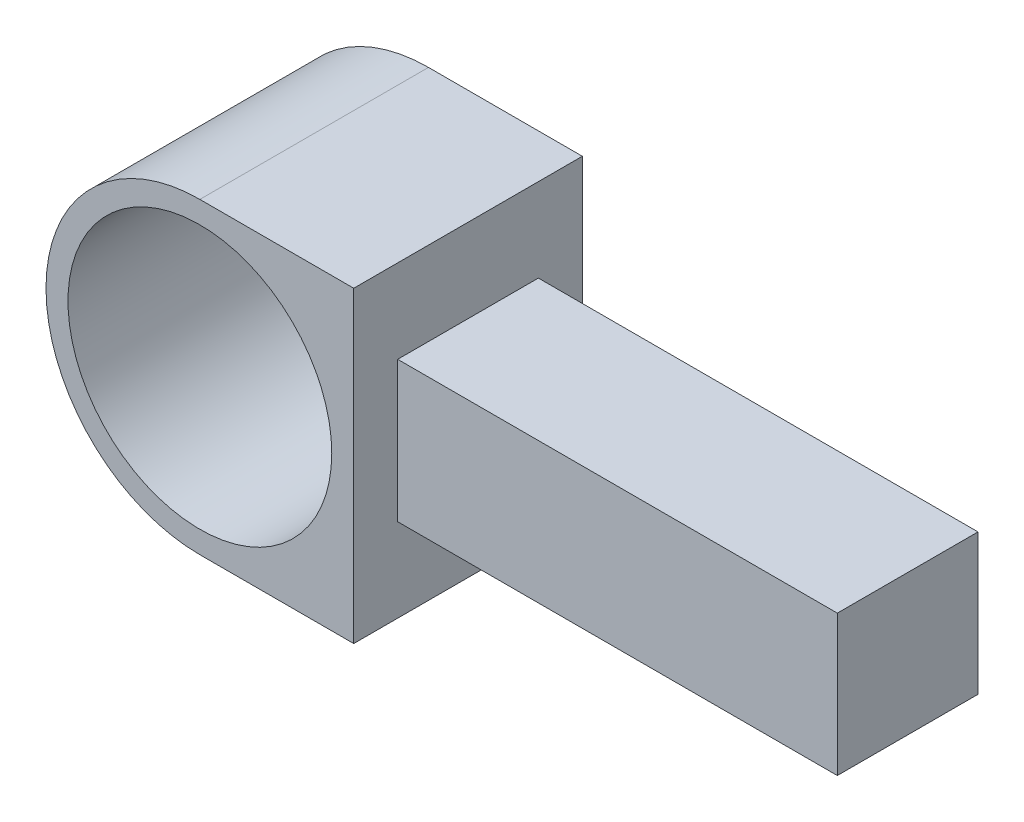
ISO-10303-21;
HEADER;
FILE_DESCRIPTION(('STEP AP214'),'2;1');
FILE_NAME('part.step','',(''),(''),'','','');
FILE_SCHEMA(('AUTOMOTIVE_DESIGN { 1 0 10303 214 1 1 1 1 }'));
ENDSEC;
DATA;
#1=APPLICATION_CONTEXT('core data for automotive mechanical design processes');
#2=APPLICATION_PROTOCOL_DEFINITION('international standard','automotive_design',2000,#1);
#3=PRODUCT_CONTEXT('',#1,'mechanical');
#4=PRODUCT('Part','Part','',(#3));
#5=PRODUCT_RELATED_PRODUCT_CATEGORY('part','',(#4));
#6=PRODUCT_DEFINITION_FORMATION('','',#4);
#7=PRODUCT_DEFINITION_CONTEXT('part definition',#1,'design');
#8=PRODUCT_DEFINITION('design','',#6,#7);
#9=PRODUCT_DEFINITION_SHAPE('','',#8);
#10=(LENGTH_UNIT() NAMED_UNIT(*) SI_UNIT(.MILLI.,.METRE.));
#11=(NAMED_UNIT(*) PLANE_ANGLE_UNIT() SI_UNIT($,.RADIAN.));
#12=(NAMED_UNIT(*) SI_UNIT($,.STERADIAN.) SOLID_ANGLE_UNIT());
#13=UNCERTAINTY_MEASURE_WITH_UNIT(LENGTH_MEASURE(1.E-05),#10,'distance_accuracy_value','');
#14=(GEOMETRIC_REPRESENTATION_CONTEXT(3) GLOBAL_UNCERTAINTY_ASSIGNED_CONTEXT((#13)) GLOBAL_UNIT_ASSIGNED_CONTEXT((#10,
#11,#12)) REPRESENTATION_CONTEXT('',''));
#15=CARTESIAN_POINT('',(0.,0.,0.));
#16=DIRECTION('',(0.,0.,1.));
#17=DIRECTION('',(1.,0.,0.));
#18=AXIS2_PLACEMENT_3D('',#15,#16,#17);
#19=CARTESIAN_POINT('',(17.5,17.5,26.));
#20=DIRECTION('',(-1.,0.,0.));
#21=DIRECTION('',(0.,0.,1.));
#22=AXIS2_PLACEMENT_3D('',#19,#20,#21);
#23=PLANE('',#22);
#24=DIRECTION('',(0.,1.,0.));
#25=VECTOR('',#24,1.);
#26=CARTESIAN_POINT('',(17.5,17.5,0.));
#27=LINE('',#26,#25);
#28=CARTESIAN_POINT('',(17.5,-17.5,0.));
#29=VERTEX_POINT('',#28);
#30=CARTESIAN_POINT('',(17.5,17.5,0.));
#31=VERTEX_POINT('',#30);
#32=EDGE_CURVE('E148',#29,#31,#27,.T.);
#33=ORIENTED_EDGE('',*,*,#32,.T.);
#34=DIRECTION('',(0.,0.,-1.));
#35=VECTOR('',#34,1.);
#36=CARTESIAN_POINT('',(17.5,17.5,26.));
#37=LINE('',#36,#35);
#38=CARTESIAN_POINT('',(17.5,17.5,26.));
#39=VERTEX_POINT('',#38);
#40=EDGE_CURVE('E153',#39,#31,#37,.T.);
#41=ORIENTED_EDGE('',*,*,#40,.F.);
#42=DIRECTION('',(0.,1.,0.));
#43=VECTOR('',#42,1.);
#44=CARTESIAN_POINT('',(17.5,17.5,26.));
#45=LINE('',#44,#43);
#46=CARTESIAN_POINT('',(17.5,-17.5,26.));
#47=VERTEX_POINT('',#46);
#48=EDGE_CURVE('E139',#47,#39,#45,.T.);
#49=ORIENTED_EDGE('',*,*,#48,.F.);
#50=DIRECTION('',(0.,0.,-1.));
#51=VECTOR('',#50,1.);
#52=CARTESIAN_POINT('',(17.5,-17.5,26.));
#53=LINE('',#52,#51);
#54=EDGE_CURVE('E44',#47,#29,#53,.T.);
#55=ORIENTED_EDGE('',*,*,#54,.T.);
#56=EDGE_LOOP('',(#33,#41,#49,#55));
#57=FACE_BOUND('',#56,.T.);
#58=DIRECTION('',(0.,-1.,0.));
#59=VECTOR('',#58,1.);
#60=CARTESIAN_POINT('',(17.5,8.,21.));
#61=LINE('',#60,#59);
#62=CARTESIAN_POINT('',(17.5,8.,21.));
#63=VERTEX_POINT('',#62);
#64=CARTESIAN_POINT('',(17.5,-8.,21.));
#65=VERTEX_POINT('',#64);
#66=EDGE_CURVE('E51',#63,#65,#61,.T.);
#67=ORIENTED_EDGE('',*,*,#66,.F.);
#68=DIRECTION('',(0.,0.,1.));
#69=VECTOR('',#68,1.);
#70=CARTESIAN_POINT('',(17.5,8.,21.));
#71=LINE('',#70,#69);
#72=CARTESIAN_POINT('',(17.5,8.,5.));
#73=VERTEX_POINT('',#72);
#74=EDGE_CURVE('E55',#73,#63,#71,.T.);
#75=ORIENTED_EDGE('',*,*,#74,.F.);
#76=DIRECTION('',(0.,1.,0.));
#77=VECTOR('',#76,1.);
#78=CARTESIAN_POINT('',(17.5,8.,5.));
#79=LINE('',#78,#77);
#80=CARTESIAN_POINT('',(17.5,-8.,5.));
#81=VERTEX_POINT('',#80);
#82=EDGE_CURVE('E281',#81,#73,#79,.T.);
#83=ORIENTED_EDGE('',*,*,#82,.F.);
#84=DIRECTION('',(0.,0.,-1.));
#85=VECTOR('',#84,1.);
#86=CARTESIAN_POINT('',(17.5,-8.,21.));
#87=LINE('',#86,#85);
#88=EDGE_CURVE('E287',#65,#81,#87,.T.);
#89=ORIENTED_EDGE('',*,*,#88,.F.);
#90=EDGE_LOOP('',(#67,#75,#83,#89));
#91=FACE_BOUND('',#90,.T.);
#92=ADVANCED_FACE('F36',(#57,#91),#23,.F.);
#93=CARTESIAN_POINT('',(0.,0.,26.));
#94=DIRECTION('',(0.,0.,-1.));
#95=DIRECTION('',(-1.,0.,0.));
#96=AXIS2_PLACEMENT_3D('',#93,#94,#95);
#97=CYLINDRICAL_SURFACE('',#96,17.5);
#98=CARTESIAN_POINT('',(0.,0.,0.));
#99=DIRECTION('',(0.,0.,1.));
#100=DIRECTION('',(-1.,0.,0.));
#101=AXIS2_PLACEMENT_3D('',#98,#99,#100);
#102=CIRCLE('',#101,17.5);
#103=CARTESIAN_POINT('',(0.,17.5,0.));
#104=VERTEX_POINT('',#103);
#105=CARTESIAN_POINT('',(0.,-17.5,0.));
#106=VERTEX_POINT('',#105);
#107=EDGE_CURVE('E131',#104,#106,#102,.T.);
#108=ORIENTED_EDGE('',*,*,#107,.T.);
#109=DIRECTION('',(0.,0.,-1.));
#110=VECTOR('',#109,1.);
#111=CARTESIAN_POINT('',(0.,-17.5,26.));
#112=LINE('',#111,#110);
#113=CARTESIAN_POINT('',(0.,-17.5,26.));
#114=VERTEX_POINT('',#113);
#115=EDGE_CURVE('E11',#114,#106,#112,.T.);
#116=ORIENTED_EDGE('',*,*,#115,.F.);
#117=CARTESIAN_POINT('',(0.,0.,26.));
#118=DIRECTION('',(0.,0.,1.));
#119=DIRECTION('',(-1.,0.,0.));
#120=AXIS2_PLACEMENT_3D('',#117,#118,#119);
#121=CIRCLE('',#120,17.5);
#122=CARTESIAN_POINT('',(0.,17.5,26.));
#123=VERTEX_POINT('',#122);
#124=EDGE_CURVE('E133',#123,#114,#121,.T.);
#125=ORIENTED_EDGE('',*,*,#124,.F.);
#126=DIRECTION('',(0.,0.,-1.));
#127=VECTOR('',#126,1.);
#128=CARTESIAN_POINT('',(0.,17.5,26.));
#129=LINE('',#128,#127);
#130=EDGE_CURVE('E143',#123,#104,#129,.T.);
#131=ORIENTED_EDGE('',*,*,#130,.T.);
#132=EDGE_LOOP('',(#108,#116,#125,#131));
#133=FACE_BOUND('',#132,.T.);
#134=ADVANCED_FACE('F38',(#133),#97,.T.);
#135=CARTESIAN_POINT('',(0.,-17.5,26.));
#136=DIRECTION('',(0.,1.,0.));
#137=DIRECTION('',(0.,0.,1.));
#138=AXIS2_PLACEMENT_3D('',#135,#136,#137);
#139=PLANE('',#138);
#140=DIRECTION('',(1.,0.,0.));
#141=VECTOR('',#140,1.);
#142=CARTESIAN_POINT('',(0.,-17.5,0.));
#143=LINE('',#142,#141);
#144=EDGE_CURVE('E146',#106,#29,#143,.T.);
#145=ORIENTED_EDGE('',*,*,#144,.T.);
#146=ORIENTED_EDGE('',*,*,#54,.F.);
#147=DIRECTION('',(1.,0.,0.));
#148=VECTOR('',#147,1.);
#149=CARTESIAN_POINT('',(0.,-17.5,26.));
#150=LINE('',#149,#148);
#151=EDGE_CURVE('E136',#114,#47,#150,.T.);
#152=ORIENTED_EDGE('',*,*,#151,.F.);
#153=ORIENTED_EDGE('',*,*,#115,.T.);
#154=EDGE_LOOP('',(#145,#146,#152,#153));
#155=FACE_BOUND('',#154,.T.);
#156=ADVANCED_FACE('F175',(#155),#139,.F.);
#157=CARTESIAN_POINT('',(0.,17.5,26.));
#158=DIRECTION('',(0.,-1.,0.));
#159=DIRECTION('',(0.,0.,-1.));
#160=AXIS2_PLACEMENT_3D('',#157,#158,#159);
#161=PLANE('',#160);
#162=DIRECTION('',(-1.,0.,0.));
#163=VECTOR('',#162,1.);
#164=CARTESIAN_POINT('',(0.,17.5,0.));
#165=LINE('',#164,#163);
#166=EDGE_CURVE('E137',#31,#104,#165,.T.);
#167=ORIENTED_EDGE('',*,*,#166,.T.);
#168=ORIENTED_EDGE('',*,*,#130,.F.);
#169=DIRECTION('',(-1.,0.,0.));
#170=VECTOR('',#169,1.);
#171=CARTESIAN_POINT('',(0.,17.5,26.));
#172=LINE('',#171,#170);
#173=EDGE_CURVE('E141',#39,#123,#172,.T.);
#174=ORIENTED_EDGE('',*,*,#173,.F.);
#175=ORIENTED_EDGE('',*,*,#40,.T.);
#176=EDGE_LOOP('',(#167,#168,#174,#175));
#177=FACE_BOUND('',#176,.T.);
#178=ADVANCED_FACE('F168',(#177),#161,.F.);
#179=CARTESIAN_POINT('',(0.,0.,26.));
#180=DIRECTION('',(0.,0.,-1.));
#181=DIRECTION('',(-1.,0.,0.));
#182=AXIS2_PLACEMENT_3D('',#179,#180,#181);
#183=PLANE('',#182);
#184=CARTESIAN_POINT('',(0.,0.,26.));
#185=DIRECTION('',(0.,0.,1.));
#186=DIRECTION('',(1.,0.,0.));
#187=AXIS2_PLACEMENT_3D('',#184,#185,#186);
#188=CIRCLE('',#187,15.);
#189=CARTESIAN_POINT('',(15.,0.,26.));
#190=VERTEX_POINT('',#189);
#191=EDGE_CURVE('E121',#190,#190,#188,.T.);
#192=ORIENTED_EDGE('',*,*,#191,.F.);
#193=EDGE_LOOP('',(#192));
#194=FACE_BOUND('',#193,.T.);
#195=ORIENTED_EDGE('',*,*,#124,.T.);
#196=ORIENTED_EDGE('',*,*,#151,.T.);
#197=ORIENTED_EDGE('',*,*,#48,.T.);
#198=ORIENTED_EDGE('',*,*,#173,.T.);
#199=EDGE_LOOP('',(#195,#196,#197,#198));
#200=FACE_BOUND('',#199,.T.);
#201=ADVANCED_FACE('F174',(#194,#200),#183,.F.);
#202=CARTESIAN_POINT('',(0.,0.,0.));
#203=DIRECTION('',(0.,0.,-1.));
#204=DIRECTION('',(-1.,0.,0.));
#205=AXIS2_PLACEMENT_3D('',#202,#203,#204);
#206=PLANE('',#205);
#207=CARTESIAN_POINT('',(0.,0.,0.));
#208=DIRECTION('',(0.,0.,1.));
#209=DIRECTION('',(1.,0.,0.));
#210=AXIS2_PLACEMENT_3D('',#207,#208,#209);
#211=CIRCLE('',#210,15.);
#212=CARTESIAN_POINT('',(15.,0.,0.));
#213=VERTEX_POINT('',#212);
#214=EDGE_CURVE('E124',#213,#213,#211,.T.);
#215=ORIENTED_EDGE('',*,*,#214,.T.);
#216=EDGE_LOOP('',(#215));
#217=FACE_BOUND('',#216,.T.);
#218=ORIENTED_EDGE('',*,*,#107,.F.);
#219=ORIENTED_EDGE('',*,*,#166,.F.);
#220=ORIENTED_EDGE('',*,*,#32,.F.);
#221=ORIENTED_EDGE('',*,*,#144,.F.);
#222=EDGE_LOOP('',(#218,#219,#220,#221));
#223=FACE_BOUND('',#222,.T.);
#224=ADVANCED_FACE('F165',(#217,#223),#206,.T.);
#225=CARTESIAN_POINT('',(0.,0.,0.));
#226=DIRECTION('',(0.,0.,1.));
#227=DIRECTION('',(1.,0.,0.));
#228=AXIS2_PLACEMENT_3D('',#225,#226,#227);
#229=CYLINDRICAL_SURFACE('',#228,15.);
#230=CARTESIAN_POINT('',(15.,0.,0.));
#231=CARTESIAN_POINT('',(15.,0.,0.270833333333333));
#232=CARTESIAN_POINT('',(15.,0.,0.541666666666667));
#233=CARTESIAN_POINT('',(15.,0.,1.08333333333333));
#234=CARTESIAN_POINT('',(15.,0.,1.35416666666667));
#235=CARTESIAN_POINT('',(15.,0.,1.89583333333333));
#236=CARTESIAN_POINT('',(15.,0.,2.16666666666667));
#237=CARTESIAN_POINT('',(15.,0.,2.70833333333333));
#238=CARTESIAN_POINT('',(15.,0.,2.97916666666667));
#239=CARTESIAN_POINT('',(15.,0.,3.52083333333333));
#240=CARTESIAN_POINT('',(15.,0.,3.79166666666667));
#241=CARTESIAN_POINT('',(15.,0.,4.33333333333333));
#242=CARTESIAN_POINT('',(15.,0.,4.60416666666667));
#243=CARTESIAN_POINT('',(15.,0.,5.14583333333333));
#244=CARTESIAN_POINT('',(15.,0.,5.41666666666667));
#245=CARTESIAN_POINT('',(15.,0.,5.95833333333333));
#246=CARTESIAN_POINT('',(15.,0.,6.22916666666667));
#247=CARTESIAN_POINT('',(15.,0.,6.77083333333333));
#248=CARTESIAN_POINT('',(15.,0.,7.04166666666667));
#249=CARTESIAN_POINT('',(15.,0.,7.58333333333333));
#250=CARTESIAN_POINT('',(15.,0.,7.85416666666667));
#251=CARTESIAN_POINT('',(15.,0.,8.39583333333333));
#252=CARTESIAN_POINT('',(15.,0.,8.66666666666667));
#253=CARTESIAN_POINT('',(15.,0.,9.20833333333333));
#254=CARTESIAN_POINT('',(15.,0.,9.47916666666667));
#255=CARTESIAN_POINT('',(15.,0.,10.0208333333333));
#256=CARTESIAN_POINT('',(15.,0.,10.2916666666667));
#257=CARTESIAN_POINT('',(15.,0.,10.8333333333333));
#258=CARTESIAN_POINT('',(15.,0.,11.1041666666667));
#259=CARTESIAN_POINT('',(15.,0.,11.6458333333333));
#260=CARTESIAN_POINT('',(15.,0.,11.9166666666667));
#261=CARTESIAN_POINT('',(15.,0.,12.4583333333333));
#262=CARTESIAN_POINT('',(15.,0.,12.7291666666667));
#263=CARTESIAN_POINT('',(15.,0.,13.2708333333333));
#264=CARTESIAN_POINT('',(15.,0.,13.5416666666667));
#265=CARTESIAN_POINT('',(15.,0.,14.0833333333333));
#266=CARTESIAN_POINT('',(15.,0.,14.3541666666667));
#267=CARTESIAN_POINT('',(15.,0.,14.8958333333333));
#268=CARTESIAN_POINT('',(15.,0.,15.1666666666667));
#269=CARTESIAN_POINT('',(15.,0.,15.7083333333333));
#270=CARTESIAN_POINT('',(15.,0.,15.9791666666667));
#271=CARTESIAN_POINT('',(15.,0.,16.5208333333333));
#272=CARTESIAN_POINT('',(15.,0.,16.7916666666667));
#273=CARTESIAN_POINT('',(15.,0.,17.3333333333333));
#274=CARTESIAN_POINT('',(15.,0.,17.6041666666667));
#275=CARTESIAN_POINT('',(15.,0.,18.1458333333333));
#276=CARTESIAN_POINT('',(15.,0.,18.4166666666667));
#277=CARTESIAN_POINT('',(15.,0.,18.9583333333333));
#278=CARTESIAN_POINT('',(15.,0.,19.2291666666667));
#279=CARTESIAN_POINT('',(15.,0.,19.7708333333333));
#280=CARTESIAN_POINT('',(15.,0.,20.0416666666667));
#281=CARTESIAN_POINT('',(15.,0.,20.5833333333333));
#282=CARTESIAN_POINT('',(15.,0.,20.8541666666667));
#283=CARTESIAN_POINT('',(15.,0.,21.3958333333333));
#284=CARTESIAN_POINT('',(15.,0.,21.6666666666667));
#285=CARTESIAN_POINT('',(15.,0.,22.2083333333333));
#286=CARTESIAN_POINT('',(15.,0.,22.4791666666667));
#287=CARTESIAN_POINT('',(15.,0.,23.0208333333333));
#288=CARTESIAN_POINT('',(15.,0.,23.2916666666667));
#289=CARTESIAN_POINT('',(15.,0.,23.8333333333333));
#290=CARTESIAN_POINT('',(15.,0.,24.1041666666667));
#291=CARTESIAN_POINT('',(15.,0.,24.6458333333333));
#292=CARTESIAN_POINT('',(15.,0.,24.9166666666667));
#293=CARTESIAN_POINT('',(15.,0.,25.4583333333333));
#294=CARTESIAN_POINT('',(15.,0.,25.7291666666667));
#295=CARTESIAN_POINT('',(15.,0.,26.));
#296=B_SPLINE_CURVE_WITH_KNOTS('',3,(#230,#231,#232,#233,#234,#235,#236,#237,#238,#239,#240,
#241,#242,#243,#244,#245,#246,#247,#248,#249,#250,#251,#252,#253,#254,#255,#256,#257,#258,#259,
#260,#261,#262,#263,#264,#265,#266,#267,#268,#269,#270,#271,#272,#273,#274,#275,#276,#277,#278,
#279,#280,#281,#282,#283,#284,#285,#286,#287,#288,#289,#290,#291,#292,#293,#294,#295),
.UNSPECIFIED.,.F.,.F.,(4,2,2,2,2,2,2,2,2,2,2,2,2,2,2,2,2,2,2,2,2,2,2,2,2,2,2,2,2,2,2,2,4),(0.,
0.8125,1.625,2.4375,3.25,4.0625,4.875,5.6875,6.5,7.3125,8.125,8.9375,9.75,10.5625,11.375,
12.1875,13.,13.8125,14.625,15.4375,16.25,17.0625,17.875,18.6875,19.5,20.3125,21.125,21.9375,
22.75,23.5625,24.375,25.1875,26.),.UNSPECIFIED.);
#297=EDGE_CURVE('BSEAM189',#213,#190,#296,.T.);
#298=ORIENTED_EDGE('',*,*,#214,.F.);
#299=ORIENTED_EDGE('',*,*,#191,.T.);
#300=ORIENTED_EDGE('',*,*,#297,.T.);
#301=ORIENTED_EDGE('',*,*,#297,.F.);
#302=EDGE_LOOP('',(#298,#300,#299,#301));
#303=FACE_BOUND('',#302,.T.);
#304=ADVANCED_FACE('F189',(#303),#229,.F.);
#305=CARTESIAN_POINT('',(67.5,8.,21.));
#306=DIRECTION('',(0.,0.,-1.));
#307=DIRECTION('',(0.,1.,0.));
#308=AXIS2_PLACEMENT_3D('',#305,#306,#307);
#309=PLANE('',#308);
#310=ORIENTED_EDGE('',*,*,#66,.T.);
#311=DIRECTION('',(-1.,0.,0.));
#312=VECTOR('',#311,1.);
#313=CARTESIAN_POINT('',(67.5,-8.,21.));
#314=LINE('',#313,#312);
#315=CARTESIAN_POINT('',(67.5,-8.,21.));
#316=VERTEX_POINT('',#315);
#317=EDGE_CURVE('E104',#316,#65,#314,.T.);
#318=ORIENTED_EDGE('',*,*,#317,.F.);
#319=DIRECTION('',(0.,-1.,0.));
#320=VECTOR('',#319,1.);
#321=CARTESIAN_POINT('',(67.5,8.,21.));
#322=LINE('',#321,#320);
#323=CARTESIAN_POINT('',(67.5,8.,21.));
#324=VERTEX_POINT('',#323);
#325=EDGE_CURVE('E110',#324,#316,#322,.T.);
#326=ORIENTED_EDGE('',*,*,#325,.F.);
#327=DIRECTION('',(-1.,0.,0.));
#328=VECTOR('',#327,1.);
#329=CARTESIAN_POINT('',(67.5,8.,21.));
#330=LINE('',#329,#328);
#331=EDGE_CURVE('E279',#324,#63,#330,.T.);
#332=ORIENTED_EDGE('',*,*,#331,.T.);
#333=EDGE_LOOP('',(#310,#318,#326,#332));
#334=FACE_BOUND('',#333,.T.);
#335=ADVANCED_FACE('F120',(#334),#309,.F.);
#336=CARTESIAN_POINT('',(67.5,-8.,21.));
#337=DIRECTION('',(0.,1.,0.));
#338=DIRECTION('',(0.,0.,1.));
#339=AXIS2_PLACEMENT_3D('',#336,#337,#338);
#340=PLANE('',#339);
#341=ORIENTED_EDGE('',*,*,#88,.T.);
#342=DIRECTION('',(-1.,0.,0.));
#343=VECTOR('',#342,1.);
#344=CARTESIAN_POINT('',(67.5,-8.,5.));
#345=LINE('',#344,#343);
#346=CARTESIAN_POINT('',(67.5,-8.,5.));
#347=VERTEX_POINT('',#346);
#348=EDGE_CURVE('E106',#347,#81,#345,.T.);
#349=ORIENTED_EDGE('',*,*,#348,.F.);
#350=DIRECTION('',(0.,0.,-1.));
#351=VECTOR('',#350,1.);
#352=CARTESIAN_POINT('',(67.5,-8.,21.));
#353=LINE('',#352,#351);
#354=EDGE_CURVE('E99',#316,#347,#353,.T.);
#355=ORIENTED_EDGE('',*,*,#354,.F.);
#356=ORIENTED_EDGE('',*,*,#317,.T.);
#357=EDGE_LOOP('',(#341,#349,#355,#356));
#358=FACE_BOUND('',#357,.T.);
#359=ADVANCED_FACE('F102',(#358),#340,.F.);
#360=CARTESIAN_POINT('',(67.5,8.,5.));
#361=DIRECTION('',(0.,0.,1.));
#362=DIRECTION('',(0.,-1.,0.));
#363=AXIS2_PLACEMENT_3D('',#360,#361,#362);
#364=PLANE('',#363);
#365=ORIENTED_EDGE('',*,*,#82,.T.);
#366=DIRECTION('',(-1.,0.,0.));
#367=VECTOR('',#366,1.);
#368=CARTESIAN_POINT('',(67.5,8.,5.));
#369=LINE('',#368,#367);
#370=CARTESIAN_POINT('',(67.5,8.,5.));
#371=VERTEX_POINT('',#370);
#372=EDGE_CURVE('E126',#371,#73,#369,.T.);
#373=ORIENTED_EDGE('',*,*,#372,.F.);
#374=DIRECTION('',(0.,1.,0.));
#375=VECTOR('',#374,1.);
#376=CARTESIAN_POINT('',(67.5,8.,5.));
#377=LINE('',#376,#375);
#378=EDGE_CURVE('E109',#347,#371,#377,.T.);
#379=ORIENTED_EDGE('',*,*,#378,.F.);
#380=ORIENTED_EDGE('',*,*,#348,.T.);
#381=EDGE_LOOP('',(#365,#373,#379,#380));
#382=FACE_BOUND('',#381,.T.);
#383=ADVANCED_FACE('F201',(#382),#364,.F.);
#384=CARTESIAN_POINT('',(67.5,8.,21.));
#385=DIRECTION('',(0.,-1.,0.));
#386=DIRECTION('',(0.,0.,-1.));
#387=AXIS2_PLACEMENT_3D('',#384,#385,#386);
#388=PLANE('',#387);
#389=ORIENTED_EDGE('',*,*,#74,.T.);
#390=ORIENTED_EDGE('',*,*,#331,.F.);
#391=DIRECTION('',(0.,0.,1.));
#392=VECTOR('',#391,1.);
#393=CARTESIAN_POINT('',(67.5,8.,21.));
#394=LINE('',#393,#392);
#395=EDGE_CURVE('E115',#371,#324,#394,.T.);
#396=ORIENTED_EDGE('',*,*,#395,.F.);
#397=ORIENTED_EDGE('',*,*,#372,.T.);
#398=EDGE_LOOP('',(#389,#390,#396,#397));
#399=FACE_BOUND('',#398,.T.);
#400=ADVANCED_FACE('F204',(#399),#388,.F.);
#401=CARTESIAN_POINT('',(67.5,0.,0.));
#402=DIRECTION('',(1.,0.,0.));
#403=DIRECTION('',(0.,0.,-1.));
#404=AXIS2_PLACEMENT_3D('',#401,#402,#403);
#405=PLANE('',#404);
#406=ORIENTED_EDGE('',*,*,#325,.T.);
#407=ORIENTED_EDGE('',*,*,#354,.T.);
#408=ORIENTED_EDGE('',*,*,#378,.T.);
#409=ORIENTED_EDGE('',*,*,#395,.T.);
#410=EDGE_LOOP('',(#406,#407,#408,#409));
#411=FACE_BOUND('',#410,.T.);
#412=ADVANCED_FACE('F113',(#411),#405,.T.);
#413=CLOSED_SHELL('',(#92,#134,#156,#178,#201,#224,#304,#335,#359,#383,#400,#412));
#414=MANIFOLD_SOLID_BREP('B2',#413);
#415=ADVANCED_BREP_SHAPE_REPRESENTATION('',(#18,#414),#14);
#416=SHAPE_DEFINITION_REPRESENTATION(#9,#415);
ENDSEC;
END-ISO-10303-21;
